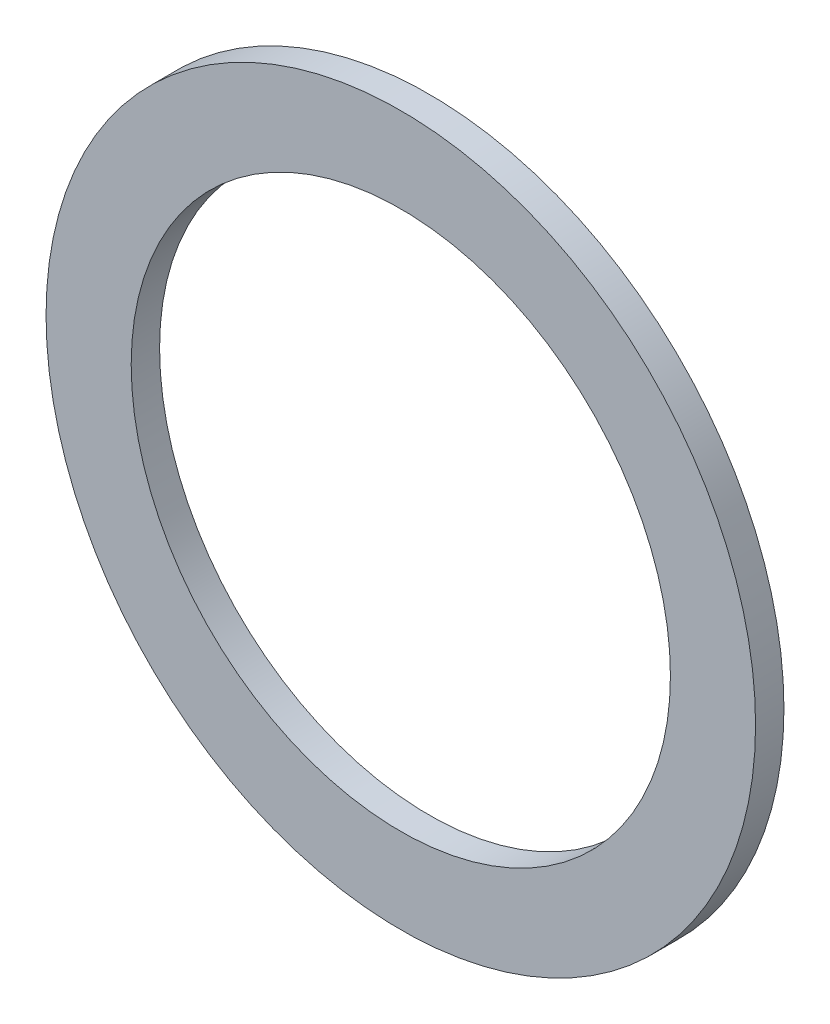
ISO-10303-21;
HEADER;
FILE_DESCRIPTION(('STEP AP214'),'2;1');
FILE_NAME('part.step','',(''),(''),'','','');
FILE_SCHEMA(('AUTOMOTIVE_DESIGN { 1 0 10303 214 1 1 1 1 }'));
ENDSEC;
DATA;
#1=APPLICATION_CONTEXT('core data for automotive mechanical design processes');
#2=APPLICATION_PROTOCOL_DEFINITION('international standard','automotive_design',2000,#1);
#3=PRODUCT_CONTEXT('',#1,'mechanical');
#4=PRODUCT('Part','Part','',(#3));
#5=PRODUCT_RELATED_PRODUCT_CATEGORY('part','',(#4));
#6=PRODUCT_DEFINITION_FORMATION('','',#4);
#7=PRODUCT_DEFINITION_CONTEXT('part definition',#1,'design');
#8=PRODUCT_DEFINITION('design','',#6,#7);
#9=PRODUCT_DEFINITION_SHAPE('','',#8);
#10=(LENGTH_UNIT() NAMED_UNIT(*) SI_UNIT(.MILLI.,.METRE.));
#11=(NAMED_UNIT(*) PLANE_ANGLE_UNIT() SI_UNIT($,.RADIAN.));
#12=(NAMED_UNIT(*) SI_UNIT($,.STERADIAN.) SOLID_ANGLE_UNIT());
#13=UNCERTAINTY_MEASURE_WITH_UNIT(LENGTH_MEASURE(1.E-05),#10,'distance_accuracy_value','');
#14=(GEOMETRIC_REPRESENTATION_CONTEXT(3) GLOBAL_UNCERTAINTY_ASSIGNED_CONTEXT((#13)) GLOBAL_UNIT_ASSIGNED_CONTEXT((#10,
#11,#12)) REPRESENTATION_CONTEXT('',''));
#15=CARTESIAN_POINT('',(0.,0.,0.));
#16=DIRECTION('',(0.,0.,1.));
#17=DIRECTION('',(1.,0.,0.));
#18=AXIS2_PLACEMENT_3D('',#15,#16,#17);
#19=CARTESIAN_POINT('',(0.,0.,2.));
#20=DIRECTION('',(0.,0.,-1.));
#21=DIRECTION('',(-1.,0.,0.));
#22=AXIS2_PLACEMENT_3D('',#19,#20,#21);
#23=CYLINDRICAL_SURFACE('',#22,25.);
#24=CARTESIAN_POINT('',(0.,0.,2.));
#25=DIRECTION('',(0.,0.,1.));
#26=DIRECTION('',(1.,0.,0.));
#27=AXIS2_PLACEMENT_3D('',#24,#25,#26);
#28=CIRCLE('',#27,25.);
#29=CARTESIAN_POINT('',(25.,0.,2.));
#30=VERTEX_POINT('',#29);
#31=EDGE_CURVE('E10',#30,#30,#28,.T.);
#32=ORIENTED_EDGE('',*,*,#31,.F.);
#33=EDGE_LOOP('',(#32));
#34=FACE_BOUND('',#33,.T.);
#35=CARTESIAN_POINT('',(0.,0.,0.));
#36=DIRECTION('',(0.,0.,1.));
#37=DIRECTION('',(1.,0.,0.));
#38=AXIS2_PLACEMENT_3D('',#35,#36,#37);
#39=CIRCLE('',#38,25.);
#40=CARTESIAN_POINT('',(25.,0.,0.));
#41=VERTEX_POINT('',#40);
#42=EDGE_CURVE('E46',#41,#41,#39,.T.);
#43=ORIENTED_EDGE('',*,*,#42,.T.);
#44=EDGE_LOOP('',(#43));
#45=FACE_BOUND('',#44,.T.);
#46=ADVANCED_FACE('F43',(#34,#45),#23,.T.);
#47=CARTESIAN_POINT('',(0.,0.,2.));
#48=DIRECTION('',(0.,0.,1.));
#49=DIRECTION('',(1.,0.,0.));
#50=AXIS2_PLACEMENT_3D('',#47,#48,#49);
#51=PLANE('',#50);
#52=CARTESIAN_POINT('',(0.,0.,2.));
#53=DIRECTION('',(0.,0.,1.));
#54=DIRECTION('',(1.,0.,0.));
#55=AXIS2_PLACEMENT_3D('',#52,#53,#54);
#56=CIRCLE('',#55,19.);
#57=CARTESIAN_POINT('',(19.,0.,2.));
#58=VERTEX_POINT('',#57);
#59=EDGE_CURVE('E57',#58,#58,#56,.T.);
#60=ORIENTED_EDGE('',*,*,#59,.F.);
#61=EDGE_LOOP('',(#60));
#62=FACE_BOUND('',#61,.T.);
#63=ORIENTED_EDGE('',*,*,#31,.T.);
#64=EDGE_LOOP('',(#63));
#65=FACE_BOUND('',#64,.T.);
#66=ADVANCED_FACE('F74',(#62,#65),#51,.T.);
#67=CARTESIAN_POINT('',(0.,0.,0.));
#68=DIRECTION('',(0.,0.,1.));
#69=DIRECTION('',(1.,0.,0.));
#70=AXIS2_PLACEMENT_3D('',#67,#68,#69);
#71=PLANE('',#70);
#72=CARTESIAN_POINT('',(0.,0.,0.));
#73=DIRECTION('',(0.,0.,1.));
#74=DIRECTION('',(1.,0.,0.));
#75=AXIS2_PLACEMENT_3D('',#72,#73,#74);
#76=CIRCLE('',#75,19.);
#77=CARTESIAN_POINT('',(19.,0.,0.));
#78=VERTEX_POINT('',#77);
#79=EDGE_CURVE('E55',#78,#78,#76,.T.);
#80=ORIENTED_EDGE('',*,*,#79,.T.);
#81=EDGE_LOOP('',(#80));
#82=FACE_BOUND('',#81,.T.);
#83=ORIENTED_EDGE('',*,*,#42,.F.);
#84=EDGE_LOOP('',(#83));
#85=FACE_BOUND('',#84,.T.);
#86=ADVANCED_FACE('F65',(#82,#85),#71,.F.);
#87=CARTESIAN_POINT('',(0.,0.,0.));
#88=DIRECTION('',(0.,0.,1.));
#89=DIRECTION('',(1.,0.,0.));
#90=AXIS2_PLACEMENT_3D('',#87,#88,#89);
#91=CYLINDRICAL_SURFACE('',#90,19.);
#92=ORIENTED_EDGE('',*,*,#79,.F.);
#93=EDGE_LOOP('',(#92));
#94=FACE_BOUND('',#93,.T.);
#95=ORIENTED_EDGE('',*,*,#59,.T.);
#96=EDGE_LOOP('',(#95));
#97=FACE_BOUND('',#96,.T.);
#98=ADVANCED_FACE('F68',(#94,#97),#91,.F.);
#99=CLOSED_SHELL('',(#46,#66,#86,#98));
#100=MANIFOLD_SOLID_BREP('B2',#99);
#101=ADVANCED_BREP_SHAPE_REPRESENTATION('',(#18,#100),#14);
#102=SHAPE_DEFINITION_REPRESENTATION(#9,#101);
ENDSEC;
END-ISO-10303-21;
